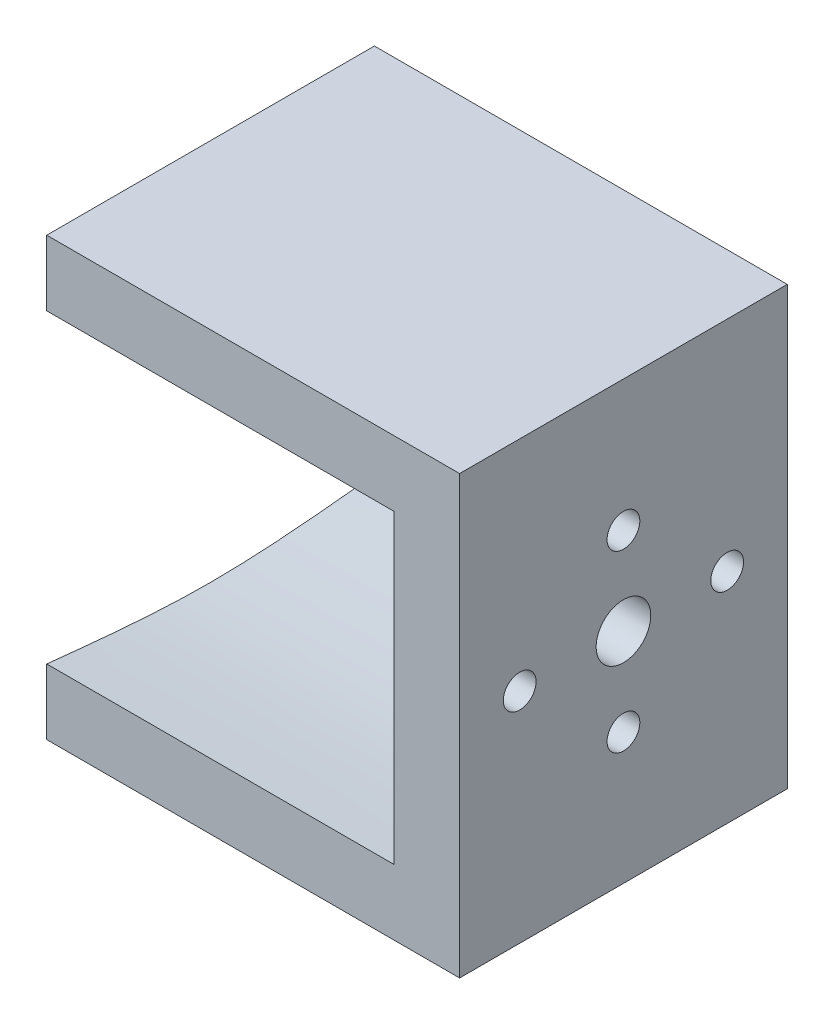
ISO-10303-21;
HEADER;
FILE_DESCRIPTION(('STEP AP214'),'2;1');
FILE_NAME('part.step','',(''),(''),'','','');
FILE_SCHEMA(('AUTOMOTIVE_DESIGN { 1 0 10303 214 1 1 1 1 }'));
ENDSEC;
DATA;
#1=APPLICATION_CONTEXT('core data for automotive mechanical design processes');
#2=APPLICATION_PROTOCOL_DEFINITION('international standard','automotive_design',2000,#1);
#3=PRODUCT_CONTEXT('',#1,'mechanical');
#4=PRODUCT('Part','Part','',(#3));
#5=PRODUCT_RELATED_PRODUCT_CATEGORY('part','',(#4));
#6=PRODUCT_DEFINITION_FORMATION('','',#4);
#7=PRODUCT_DEFINITION_CONTEXT('part definition',#1,'design');
#8=PRODUCT_DEFINITION('design','',#6,#7);
#9=PRODUCT_DEFINITION_SHAPE('','',#8);
#10=(LENGTH_UNIT() NAMED_UNIT(*) SI_UNIT(.MILLI.,.METRE.));
#11=(NAMED_UNIT(*) PLANE_ANGLE_UNIT() SI_UNIT($,.RADIAN.));
#12=(NAMED_UNIT(*) SI_UNIT($,.STERADIAN.) SOLID_ANGLE_UNIT());
#13=UNCERTAINTY_MEASURE_WITH_UNIT(LENGTH_MEASURE(1.E-05),#10,'distance_accuracy_value','');
#14=(GEOMETRIC_REPRESENTATION_CONTEXT(3) GLOBAL_UNCERTAINTY_ASSIGNED_CONTEXT((#13)) GLOBAL_UNIT_ASSIGNED_CONTEXT((#10,
#11,#12)) REPRESENTATION_CONTEXT('',''));
#15=CARTESIAN_POINT('',(0.,0.,0.));
#16=DIRECTION('',(0.,0.,1.));
#17=DIRECTION('',(1.,0.,0.));
#18=AXIS2_PLACEMENT_3D('',#15,#16,#17);
#19=CARTESIAN_POINT('',(-18.9010689243219,0.,30.));
#20=DIRECTION('',(1.,0.,0.));
#21=DIRECTION('',(0.,0.,-1.));
#22=AXIS2_PLACEMENT_3D('',#19,#20,#21);
#23=PLANE('',#22);
#24=DIRECTION('',(0.,-1.,0.));
#25=VECTOR('',#24,1.);
#26=CARTESIAN_POINT('',(-18.9010689243219,0.,30.));
#27=LINE('',#26,#25);
#28=CARTESIAN_POINT('',(-18.9010689243219,-14.,30.));
#29=VERTEX_POINT('',#28);
#30=CARTESIAN_POINT('',(-18.9010689243219,-20.,30.));
#31=VERTEX_POINT('',#30);
#32=EDGE_CURVE('E95',#29,#31,#27,.T.);
#33=ORIENTED_EDGE('',*,*,#32,.F.);
#34=CARTESIAN_POINT('',(-18.9010689243219,-14.,0.));
#35=CARTESIAN_POINT('',(-18.9010689243219,-14.5166129802611,5.));
#36=CARTESIAN_POINT('',(-18.9010689243219,-15.5498389407832,15.));
#37=CARTESIAN_POINT('',(-18.9010689243219,-14.5166129802611,25.));
#38=CARTESIAN_POINT('',(-18.9010689243219,-14.,30.));
#39=B_SPLINE_CURVE_WITH_KNOTS('',3,(#34,#35,#36,#37,#38),.UNSPECIFIED.,.F.,.F.,(4,1,4),(0.,0.5,
1.),.UNSPECIFIED.);
#40=CARTESIAN_POINT('',(-18.9010689243219,-14.,0.));
#41=VERTEX_POINT('',#40);
#42=EDGE_CURVE('E112',#41,#29,#39,.T.);
#43=ORIENTED_EDGE('',*,*,#42,.F.);
#44=DIRECTION('',(0.,-1.,0.));
#45=VECTOR('',#44,1.);
#46=CARTESIAN_POINT('',(-18.9010689243219,0.,0.));
#47=LINE('',#46,#45);
#48=CARTESIAN_POINT('',(-18.9010689243219,-20.,0.));
#49=VERTEX_POINT('',#48);
#50=EDGE_CURVE('E148',#41,#49,#47,.T.);
#51=ORIENTED_EDGE('',*,*,#50,.T.);
#52=DIRECTION('',(0.,0.,-1.));
#53=VECTOR('',#52,1.);
#54=CARTESIAN_POINT('',(-18.9010689243219,-20.,30.));
#55=LINE('',#54,#53);
#56=EDGE_CURVE('E11',#31,#49,#55,.T.);
#57=ORIENTED_EDGE('',*,*,#56,.F.);
#58=EDGE_LOOP('',(#33,#43,#51,#57));
#59=FACE_BOUND('',#58,.T.);
#60=ADVANCED_FACE('F39',(#59),#23,.F.);
#61=CARTESIAN_POINT('',(0.,-20.,30.));
#62=DIRECTION('',(0.,1.,0.));
#63=DIRECTION('',(0.,0.,1.));
#64=AXIS2_PLACEMENT_3D('',#61,#62,#63);
#65=PLANE('',#64);
#66=DIRECTION('',(1.,0.,0.));
#67=VECTOR('',#66,1.);
#68=CARTESIAN_POINT('',(0.,-20.,0.));
#69=LINE('',#68,#67);
#70=CARTESIAN_POINT('',(18.9010689243219,-20.,0.));
#71=VERTEX_POINT('',#70);
#72=EDGE_CURVE('E151',#49,#71,#69,.T.);
#73=ORIENTED_EDGE('',*,*,#72,.T.);
#74=DIRECTION('',(0.,0.,-1.));
#75=VECTOR('',#74,1.);
#76=CARTESIAN_POINT('',(18.9010689243219,-20.,30.));
#77=LINE('',#76,#75);
#78=CARTESIAN_POINT('',(18.9010689243219,-20.,30.));
#79=VERTEX_POINT('',#78);
#80=EDGE_CURVE('E47',#79,#71,#77,.T.);
#81=ORIENTED_EDGE('',*,*,#80,.F.);
#82=DIRECTION('',(1.,0.,0.));
#83=VECTOR('',#82,1.);
#84=CARTESIAN_POINT('',(0.,-20.,30.));
#85=LINE('',#84,#83);
#86=EDGE_CURVE('E121',#31,#79,#85,.T.);
#87=ORIENTED_EDGE('',*,*,#86,.F.);
#88=ORIENTED_EDGE('',*,*,#56,.T.);
#89=EDGE_LOOP('',(#73,#81,#87,#88));
#90=FACE_BOUND('',#89,.T.);
#91=ADVANCED_FACE('F179',(#90),#65,.F.);
#92=CARTESIAN_POINT('',(18.9010689243219,0.,30.));
#93=DIRECTION('',(-1.,0.,0.));
#94=DIRECTION('',(0.,0.,1.));
#95=AXIS2_PLACEMENT_3D('',#92,#93,#94);
#96=PLANE('',#95);
#97=CARTESIAN_POINT('',(18.9010689243219,8.00000000000001,15.));
#98=DIRECTION('',(-1.,0.,0.));
#99=DIRECTION('',(0.,0.,1.));
#100=AXIS2_PLACEMENT_3D('',#97,#98,#99);
#101=CIRCLE('',#100,1.5);
#102=CARTESIAN_POINT('',(18.9010689243219,8.00000000000001,16.5));
#103=VERTEX_POINT('',#102);
#104=EDGE_CURVE('E149',#103,#103,#101,.T.);
#105=ORIENTED_EDGE('',*,*,#104,.T.);
#106=EDGE_LOOP('',(#105));
#107=FACE_BOUND('',#106,.T.);
#108=CARTESIAN_POINT('',(18.9010689243219,0.,24.5));
#109=DIRECTION('',(-1.,0.,0.));
#110=DIRECTION('',(0.,0.,1.));
#111=AXIS2_PLACEMENT_3D('',#108,#109,#110);
#112=CIRCLE('',#111,1.5);
#113=CARTESIAN_POINT('',(18.9010689243219,0.,26.));
#114=VERTEX_POINT('',#113);
#115=EDGE_CURVE('E259',#114,#114,#112,.T.);
#116=ORIENTED_EDGE('',*,*,#115,.T.);
#117=EDGE_LOOP('',(#116));
#118=FACE_BOUND('',#117,.T.);
#119=CARTESIAN_POINT('',(18.9010689243219,0.,5.5));
#120=DIRECTION('',(-1.,0.,0.));
#121=DIRECTION('',(0.,0.,1.));
#122=AXIS2_PLACEMENT_3D('',#119,#120,#121);
#123=CIRCLE('',#122,1.5);
#124=CARTESIAN_POINT('',(18.9010689243219,0.,7.));
#125=VERTEX_POINT('',#124);
#126=EDGE_CURVE('E253',#125,#125,#123,.T.);
#127=ORIENTED_EDGE('',*,*,#126,.T.);
#128=EDGE_LOOP('',(#127));
#129=FACE_BOUND('',#128,.T.);
#130=CARTESIAN_POINT('',(18.9010689243219,-7.99999999999999,15.));
#131=DIRECTION('',(-1.,0.,0.));
#132=DIRECTION('',(0.,0.,1.));
#133=AXIS2_PLACEMENT_3D('',#130,#131,#132);
#134=CIRCLE('',#133,1.5);
#135=CARTESIAN_POINT('',(18.9010689243219,-7.99999999999999,16.5));
#136=VERTEX_POINT('',#135);
#137=EDGE_CURVE('E133',#136,#136,#134,.T.);
#138=ORIENTED_EDGE('',*,*,#137,.T.);
#139=EDGE_LOOP('',(#138));
#140=FACE_BOUND('',#139,.T.);
#141=CARTESIAN_POINT('',(18.9010689243219,0.,15.));
#142=DIRECTION('',(-1.,0.,0.));
#143=DIRECTION('',(0.,0.,1.));
#144=AXIS2_PLACEMENT_3D('',#141,#142,#143);
#145=CIRCLE('',#144,2.5);
#146=CARTESIAN_POINT('',(18.9010689243219,0.,17.5));
#147=VERTEX_POINT('',#146);
#148=EDGE_CURVE('E264',#147,#147,#145,.T.);
#149=ORIENTED_EDGE('',*,*,#148,.T.);
#150=EDGE_LOOP('',(#149));
#151=FACE_BOUND('',#150,.T.);
#152=DIRECTION('',(0.,1.,0.));
#153=VECTOR('',#152,1.);
#154=CARTESIAN_POINT('',(18.9010689243219,0.,0.));
#155=LINE('',#154,#153);
#156=CARTESIAN_POINT('',(18.9010689243219,20.,0.));
#157=VERTEX_POINT('',#156);
#158=EDGE_CURVE('E153',#71,#157,#155,.T.);
#159=ORIENTED_EDGE('',*,*,#158,.T.);
#160=DIRECTION('',(0.,0.,-1.));
#161=VECTOR('',#160,1.);
#162=CARTESIAN_POINT('',(18.9010689243219,20.,30.));
#163=LINE('',#162,#161);
#164=CARTESIAN_POINT('',(18.9010689243219,20.,30.));
#165=VERTEX_POINT('',#164);
#166=EDGE_CURVE('E163',#165,#157,#163,.T.);
#167=ORIENTED_EDGE('',*,*,#166,.F.);
#168=DIRECTION('',(0.,1.,0.));
#169=VECTOR('',#168,1.);
#170=CARTESIAN_POINT('',(18.9010689243219,0.,30.));
#171=LINE('',#170,#169);
#172=EDGE_CURVE('E137',#79,#165,#171,.T.);
#173=ORIENTED_EDGE('',*,*,#172,.F.);
#174=ORIENTED_EDGE('',*,*,#80,.T.);
#175=EDGE_LOOP('',(#159,#167,#173,#174));
#176=FACE_BOUND('',#175,.T.);
#177=ADVANCED_FACE('F169',(#107,#118,#129,#140,#151,#176),#96,.F.);
#178=CARTESIAN_POINT('',(0.,20.,30.));
#179=DIRECTION('',(0.,1.,0.));
#180=DIRECTION('',(0.,0.,1.));
#181=AXIS2_PLACEMENT_3D('',#178,#179,#180);
#182=PLANE('',#181);
#183=DIRECTION('',(1.,0.,0.));
#184=VECTOR('',#183,1.);
#185=CARTESIAN_POINT('',(0.,20.,0.));
#186=LINE('',#185,#184);
#187=CARTESIAN_POINT('',(-18.9010689243219,20.,0.));
#188=VERTEX_POINT('',#187);
#189=EDGE_CURVE('E156',#188,#157,#186,.T.);
#190=ORIENTED_EDGE('',*,*,#189,.F.);
#191=DIRECTION('',(0.,0.,-1.));
#192=VECTOR('',#191,1.);
#193=CARTESIAN_POINT('',(-18.9010689243219,20.,30.));
#194=LINE('',#193,#192);
#195=CARTESIAN_POINT('',(-18.9010689243219,20.,30.));
#196=VERTEX_POINT('',#195);
#197=EDGE_CURVE('E55',#196,#188,#194,.T.);
#198=ORIENTED_EDGE('',*,*,#197,.F.);
#199=DIRECTION('',(1.,0.,0.));
#200=VECTOR('',#199,1.);
#201=CARTESIAN_POINT('',(0.,20.,30.));
#202=LINE('',#201,#200);
#203=EDGE_CURVE('E139',#196,#165,#202,.T.);
#204=ORIENTED_EDGE('',*,*,#203,.T.);
#205=ORIENTED_EDGE('',*,*,#166,.T.);
#206=EDGE_LOOP('',(#190,#198,#204,#205));
#207=FACE_BOUND('',#206,.T.);
#208=ADVANCED_FACE('F177',(#207),#182,.T.);
#209=CARTESIAN_POINT('',(-18.9010689243219,0.,30.));
#210=DIRECTION('',(1.,0.,0.));
#211=DIRECTION('',(0.,0.,-1.));
#212=AXIS2_PLACEMENT_3D('',#209,#210,#211);
#213=PLANE('',#212);
#214=DIRECTION('',(0.,-1.,0.));
#215=VECTOR('',#214,1.);
#216=CARTESIAN_POINT('',(-18.9010689243219,0.,0.));
#217=LINE('',#216,#215);
#218=CARTESIAN_POINT('',(-18.9010689243219,14.,0.));
#219=VERTEX_POINT('',#218);
#220=EDGE_CURVE('E159',#188,#219,#217,.T.);
#221=ORIENTED_EDGE('',*,*,#220,.T.);
#222=CARTESIAN_POINT('',(-18.9010689243219,14.,30.));
#223=CARTESIAN_POINT('',(-18.9010689243219,14.5166129802611,25.));
#224=CARTESIAN_POINT('',(-18.9010689243219,15.5498389407832,15.));
#225=CARTESIAN_POINT('',(-18.9010689243219,14.5166129802611,5.));
#226=CARTESIAN_POINT('',(-18.9010689243219,14.,0.));
#227=B_SPLINE_CURVE_WITH_KNOTS('',3,(#222,#223,#224,#225,#226),.UNSPECIFIED.,.F.,.F.,(4,1,4),
(0.,0.5,1.),.UNSPECIFIED.);
#228=CARTESIAN_POINT('',(-18.9010689243219,14.,30.));
#229=VERTEX_POINT('',#228);
#230=EDGE_CURVE('E79',#229,#219,#227,.T.);
#231=ORIENTED_EDGE('',*,*,#230,.F.);
#232=DIRECTION('',(0.,-1.,0.));
#233=VECTOR('',#232,1.);
#234=CARTESIAN_POINT('',(-18.9010689243219,0.,30.));
#235=LINE('',#234,#233);
#236=EDGE_CURVE('E141',#196,#229,#235,.T.);
#237=ORIENTED_EDGE('',*,*,#236,.F.);
#238=ORIENTED_EDGE('',*,*,#197,.T.);
#239=EDGE_LOOP('',(#221,#231,#237,#238));
#240=FACE_BOUND('',#239,.T.);
#241=ADVANCED_FACE('F190',(#240),#213,.F.);
#242=CARTESIAN_POINT('',(12.9010689243219,0.,30.));
#243=DIRECTION('',(-1.,0.,0.));
#244=DIRECTION('',(0.,0.,1.));
#245=AXIS2_PLACEMENT_3D('',#242,#243,#244);
#246=PLANE('',#245);
#247=CARTESIAN_POINT('',(12.9010689243219,8.00000000000001,15.));
#248=DIRECTION('',(-1.,0.,0.));
#249=DIRECTION('',(0.,0.,1.));
#250=AXIS2_PLACEMENT_3D('',#247,#248,#249);
#251=CIRCLE('',#250,1.5);
#252=CARTESIAN_POINT('',(12.9010689243219,8.00000000000001,16.5));
#253=VERTEX_POINT('',#252);
#254=EDGE_CURVE('E246',#253,#253,#251,.T.);
#255=ORIENTED_EDGE('',*,*,#254,.F.);
#256=EDGE_LOOP('',(#255));
#257=FACE_BOUND('',#256,.T.);
#258=CARTESIAN_POINT('',(12.9010689243219,0.,24.5));
#259=DIRECTION('',(-1.,0.,0.));
#260=DIRECTION('',(0.,0.,1.));
#261=AXIS2_PLACEMENT_3D('',#258,#259,#260);
#262=CIRCLE('',#261,1.5);
#263=CARTESIAN_POINT('',(12.9010689243219,0.,26.));
#264=VERTEX_POINT('',#263);
#265=EDGE_CURVE('E256',#264,#264,#262,.T.);
#266=ORIENTED_EDGE('',*,*,#265,.F.);
#267=EDGE_LOOP('',(#266));
#268=FACE_BOUND('',#267,.T.);
#269=CARTESIAN_POINT('',(12.9010689243219,0.,5.5));
#270=DIRECTION('',(-1.,0.,0.));
#271=DIRECTION('',(0.,0.,1.));
#272=AXIS2_PLACEMENT_3D('',#269,#270,#271);
#273=CIRCLE('',#272,1.5);
#274=CARTESIAN_POINT('',(12.9010689243219,0.,7.));
#275=VERTEX_POINT('',#274);
#276=EDGE_CURVE('E250',#275,#275,#273,.T.);
#277=ORIENTED_EDGE('',*,*,#276,.F.);
#278=EDGE_LOOP('',(#277));
#279=FACE_BOUND('',#278,.T.);
#280=CARTESIAN_POINT('',(12.9010689243219,-7.99999999999999,15.));
#281=DIRECTION('',(-1.,0.,0.));
#282=DIRECTION('',(0.,0.,1.));
#283=AXIS2_PLACEMENT_3D('',#280,#281,#282);
#284=CIRCLE('',#283,1.5);
#285=CARTESIAN_POINT('',(12.9010689243219,-7.99999999999999,16.5));
#286=VERTEX_POINT('',#285);
#287=EDGE_CURVE('E266',#286,#286,#284,.T.);
#288=ORIENTED_EDGE('',*,*,#287,.F.);
#289=EDGE_LOOP('',(#288));
#290=FACE_BOUND('',#289,.T.);
#291=CARTESIAN_POINT('',(12.9010689243219,0.,15.));
#292=DIRECTION('',(-1.,0.,0.));
#293=DIRECTION('',(0.,0.,1.));
#294=AXIS2_PLACEMENT_3D('',#291,#292,#293);
#295=CIRCLE('',#294,2.5);
#296=CARTESIAN_POINT('',(12.9010689243219,0.,17.5));
#297=VERTEX_POINT('',#296);
#298=EDGE_CURVE('E249',#297,#297,#295,.T.);
#299=ORIENTED_EDGE('',*,*,#298,.F.);
#300=EDGE_LOOP('',(#299));
#301=FACE_BOUND('',#300,.T.);
#302=DIRECTION('',(0.,1.,0.));
#303=VECTOR('',#302,1.);
#304=CARTESIAN_POINT('',(12.9010689243219,0.,0.));
#305=LINE('',#304,#303);
#306=CARTESIAN_POINT('',(12.9010689243219,-14.,0.));
#307=VERTEX_POINT('',#306);
#308=CARTESIAN_POINT('',(12.9010689243219,14.,0.));
#309=VERTEX_POINT('',#308);
#310=EDGE_CURVE('E127',#307,#309,#305,.T.);
#311=ORIENTED_EDGE('',*,*,#310,.F.);
#312=CARTESIAN_POINT('',(12.9010689243219,-14.,0.));
#313=CARTESIAN_POINT('',(12.9010689243219,-14.5166129802611,5.));
#314=CARTESIAN_POINT('',(12.9010689243219,-15.5498389407832,15.));
#315=CARTESIAN_POINT('',(12.9010689243219,-14.5166129802611,25.));
#316=CARTESIAN_POINT('',(12.9010689243219,-14.,30.));
#317=B_SPLINE_CURVE_WITH_KNOTS('',3,(#312,#313,#314,#315,#316),.UNSPECIFIED.,.F.,.F.,(4,1,4),
(0.,0.5,1.),.UNSPECIFIED.);
#318=CARTESIAN_POINT('',(12.9010689243219,-14.,30.));
#319=VERTEX_POINT('',#318);
#320=EDGE_CURVE('E87',#319,#307,#317,.F.);
#321=ORIENTED_EDGE('',*,*,#320,.F.);
#322=DIRECTION('',(0.,1.,0.));
#323=VECTOR('',#322,1.);
#324=CARTESIAN_POINT('',(12.9010689243219,0.,30.));
#325=LINE('',#324,#323);
#326=CARTESIAN_POINT('',(12.9010689243219,14.,30.));
#327=VERTEX_POINT('',#326);
#328=EDGE_CURVE('E126',#319,#327,#325,.T.);
#329=ORIENTED_EDGE('',*,*,#328,.T.);
#330=CARTESIAN_POINT('',(12.9010689243219,14.,30.));
#331=CARTESIAN_POINT('',(12.9010689243219,14.5166129802611,25.));
#332=CARTESIAN_POINT('',(12.9010689243219,15.5498389407832,15.));
#333=CARTESIAN_POINT('',(12.9010689243219,14.5166129802611,5.));
#334=CARTESIAN_POINT('',(12.9010689243219,14.,0.));
#335=B_SPLINE_CURVE_WITH_KNOTS('',3,(#330,#331,#332,#333,#334),.UNSPECIFIED.,.F.,.F.,(4,1,4),
(0.,0.5,1.),.UNSPECIFIED.);
#336=EDGE_CURVE('E234',#309,#327,#335,.F.);
#337=ORIENTED_EDGE('',*,*,#336,.F.);
#338=EDGE_LOOP('',(#311,#321,#329,#337));
#339=FACE_BOUND('',#338,.T.);
#340=ADVANCED_FACE('F193',(#257,#268,#279,#290,#301,#339),#246,.T.);
#341=CARTESIAN_POINT('',(0.,0.,30.));
#342=DIRECTION('',(0.,0.,1.));
#343=DIRECTION('',(1.,0.,0.));
#344=AXIS2_PLACEMENT_3D('',#341,#342,#343);
#345=PLANE('',#344);
#346=DIRECTION('',(1.,0.,0.));
#347=VECTOR('',#346,1.);
#348=CARTESIAN_POINT('',(0.,-14.,30.));
#349=LINE('',#348,#347);
#350=EDGE_CURVE('E114',#29,#319,#349,.T.);
#351=ORIENTED_EDGE('',*,*,#350,.F.);
#352=ORIENTED_EDGE('',*,*,#32,.T.);
#353=ORIENTED_EDGE('',*,*,#86,.T.);
#354=ORIENTED_EDGE('',*,*,#172,.T.);
#355=ORIENTED_EDGE('',*,*,#203,.F.);
#356=ORIENTED_EDGE('',*,*,#236,.T.);
#357=DIRECTION('',(1.,0.,0.));
#358=VECTOR('',#357,1.);
#359=CARTESIAN_POINT('',(0.,14.,30.));
#360=LINE('',#359,#358);
#361=EDGE_CURVE('E144',#229,#327,#360,.T.);
#362=ORIENTED_EDGE('',*,*,#361,.T.);
#363=ORIENTED_EDGE('',*,*,#328,.F.);
#364=EDGE_LOOP('',(#351,#352,#353,#354,#355,#356,#362,#363));
#365=FACE_BOUND('',#364,.T.);
#366=ADVANCED_FACE('F123',(#365),#345,.T.);
#367=CARTESIAN_POINT('',(0.,0.,0.));
#368=DIRECTION('',(0.,0.,1.));
#369=DIRECTION('',(1.,0.,0.));
#370=AXIS2_PLACEMENT_3D('',#367,#368,#369);
#371=PLANE('',#370);
#372=DIRECTION('',(1.,0.,0.));
#373=VECTOR('',#372,1.);
#374=CARTESIAN_POINT('',(0.,-14.,0.));
#375=LINE('',#374,#373);
#376=EDGE_CURVE('E116',#41,#307,#375,.T.);
#377=ORIENTED_EDGE('',*,*,#376,.T.);
#378=ORIENTED_EDGE('',*,*,#310,.T.);
#379=DIRECTION('',(1.,0.,0.));
#380=VECTOR('',#379,1.);
#381=CARTESIAN_POINT('',(0.,14.,0.));
#382=LINE('',#381,#380);
#383=EDGE_CURVE('E130',#219,#309,#382,.T.);
#384=ORIENTED_EDGE('',*,*,#383,.F.);
#385=ORIENTED_EDGE('',*,*,#220,.F.);
#386=ORIENTED_EDGE('',*,*,#189,.T.);
#387=ORIENTED_EDGE('',*,*,#158,.F.);
#388=ORIENTED_EDGE('',*,*,#72,.F.);
#389=ORIENTED_EDGE('',*,*,#50,.F.);
#390=EDGE_LOOP('',(#377,#378,#384,#385,#386,#387,#388,#389));
#391=FACE_BOUND('',#390,.T.);
#392=ADVANCED_FACE('F174',(#391),#371,.F.);
#393=CARTESIAN_POINT('',(18.9010689243219,0.,15.));
#394=DIRECTION('',(-1.,0.,0.));
#395=DIRECTION('',(0.,0.,1.));
#396=AXIS2_PLACEMENT_3D('',#393,#394,#395);
#397=CYLINDRICAL_SURFACE('',#396,2.5);
#398=ORIENTED_EDGE('',*,*,#148,.F.);
#399=EDGE_LOOP('',(#398));
#400=FACE_BOUND('',#399,.T.);
#401=ORIENTED_EDGE('',*,*,#298,.T.);
#402=EDGE_LOOP('',(#401));
#403=FACE_BOUND('',#402,.T.);
#404=ADVANCED_FACE('F200',(#400,#403),#397,.F.);
#405=CARTESIAN_POINT('',(18.9010689243219,-7.99999999999999,15.));
#406=DIRECTION('',(-1.,0.,0.));
#407=DIRECTION('',(0.,0.,1.));
#408=AXIS2_PLACEMENT_3D('',#405,#406,#407);
#409=CYLINDRICAL_SURFACE('',#408,1.5);
#410=ORIENTED_EDGE('',*,*,#137,.F.);
#411=EDGE_LOOP('',(#410));
#412=FACE_BOUND('',#411,.T.);
#413=ORIENTED_EDGE('',*,*,#287,.T.);
#414=EDGE_LOOP('',(#413));
#415=FACE_BOUND('',#414,.T.);
#416=ADVANCED_FACE('F203',(#412,#415),#409,.F.);
#417=CARTESIAN_POINT('',(18.9010689243219,0.,5.5));
#418=DIRECTION('',(-1.,0.,0.));
#419=DIRECTION('',(0.,0.,1.));
#420=AXIS2_PLACEMENT_3D('',#417,#418,#419);
#421=CYLINDRICAL_SURFACE('',#420,1.5);
#422=ORIENTED_EDGE('',*,*,#126,.F.);
#423=EDGE_LOOP('',(#422));
#424=FACE_BOUND('',#423,.T.);
#425=ORIENTED_EDGE('',*,*,#276,.T.);
#426=EDGE_LOOP('',(#425));
#427=FACE_BOUND('',#426,.T.);
#428=ADVANCED_FACE('F206',(#424,#427),#421,.F.);
#429=CARTESIAN_POINT('',(18.9010689243219,0.,24.5));
#430=DIRECTION('',(-1.,0.,0.));
#431=DIRECTION('',(0.,0.,1.));
#432=AXIS2_PLACEMENT_3D('',#429,#430,#431);
#433=CYLINDRICAL_SURFACE('',#432,1.5);
#434=ORIENTED_EDGE('',*,*,#115,.F.);
#435=EDGE_LOOP('',(#434));
#436=FACE_BOUND('',#435,.T.);
#437=ORIENTED_EDGE('',*,*,#265,.T.);
#438=EDGE_LOOP('',(#437));
#439=FACE_BOUND('',#438,.T.);
#440=ADVANCED_FACE('F211',(#436,#439),#433,.F.);
#441=CARTESIAN_POINT('',(18.9010689243219,8.00000000000001,15.));
#442=DIRECTION('',(-1.,0.,0.));
#443=DIRECTION('',(0.,0.,1.));
#444=AXIS2_PLACEMENT_3D('',#441,#442,#443);
#445=CYLINDRICAL_SURFACE('',#444,1.5);
#446=ORIENTED_EDGE('',*,*,#104,.F.);
#447=EDGE_LOOP('',(#446));
#448=FACE_BOUND('',#447,.T.);
#449=ORIENTED_EDGE('',*,*,#254,.T.);
#450=EDGE_LOOP('',(#449));
#451=FACE_BOUND('',#450,.T.);
#452=ADVANCED_FACE('F214',(#448,#451),#445,.F.);
#453=CARTESIAN_POINT('',(42.9410755944671,14.,30.));
#454=CARTESIAN_POINT('',(42.9410755944671,14.5166129802611,25.));
#455=CARTESIAN_POINT('',(42.9410755944671,15.5498389407832,15.));
#456=CARTESIAN_POINT('',(42.9410755944671,14.5166129802611,5.));
#457=CARTESIAN_POINT('',(42.9410755944671,14.,0.));
#458=B_SPLINE_CURVE_WITH_KNOTS('',3,(#453,#454,#455,#456,#457),.UNSPECIFIED.,.F.,.F.,(4,1,4),
(0.,0.5,1.),.UNSPECIFIED.);
#459=DIRECTION('',(-1.,0.,0.));
#460=VECTOR('',#459,1.);
#461=SURFACE_OF_LINEAR_EXTRUSION('',#458,#460);
#462=ORIENTED_EDGE('',*,*,#336,.T.);
#463=ORIENTED_EDGE('',*,*,#361,.F.);
#464=ORIENTED_EDGE('',*,*,#230,.T.);
#465=ORIENTED_EDGE('',*,*,#383,.T.);
#466=EDGE_LOOP('',(#462,#463,#464,#465));
#467=FACE_BOUND('',#466,.T.);
#468=ADVANCED_FACE('F221',(#467),#461,.F.);
#469=CARTESIAN_POINT('',(42.9410755944671,-14.,0.));
#470=CARTESIAN_POINT('',(42.9410755944671,-14.5166129802611,5.));
#471=CARTESIAN_POINT('',(42.9410755944671,-15.5498389407832,15.));
#472=CARTESIAN_POINT('',(42.9410755944671,-14.5166129802611,25.));
#473=CARTESIAN_POINT('',(42.9410755944671,-14.,30.));
#474=B_SPLINE_CURVE_WITH_KNOTS('',3,(#469,#470,#471,#472,#473),.UNSPECIFIED.,.F.,.F.,(4,1,4),
(0.,0.5,1.),.UNSPECIFIED.);
#475=DIRECTION('',(-1.,0.,0.));
#476=VECTOR('',#475,1.);
#477=SURFACE_OF_LINEAR_EXTRUSION('',#474,#476);
#478=ORIENTED_EDGE('',*,*,#320,.T.);
#479=ORIENTED_EDGE('',*,*,#376,.F.);
#480=ORIENTED_EDGE('',*,*,#42,.T.);
#481=ORIENTED_EDGE('',*,*,#350,.T.);
#482=EDGE_LOOP('',(#478,#479,#480,#481));
#483=FACE_BOUND('',#482,.T.);
#484=ADVANCED_FACE('F113',(#483),#477,.F.);
#485=CLOSED_SHELL('',(#60,#91,#177,#208,#241,#340,#366,#392,#404,#416,#428,#440,#452,#468,#484));
#486=MANIFOLD_SOLID_BREP('B2',#485);
#487=ADVANCED_BREP_SHAPE_REPRESENTATION('',(#18,#486),#14);
#488=SHAPE_DEFINITION_REPRESENTATION(#9,#487);
ENDSEC;
END-ISO-10303-21;
